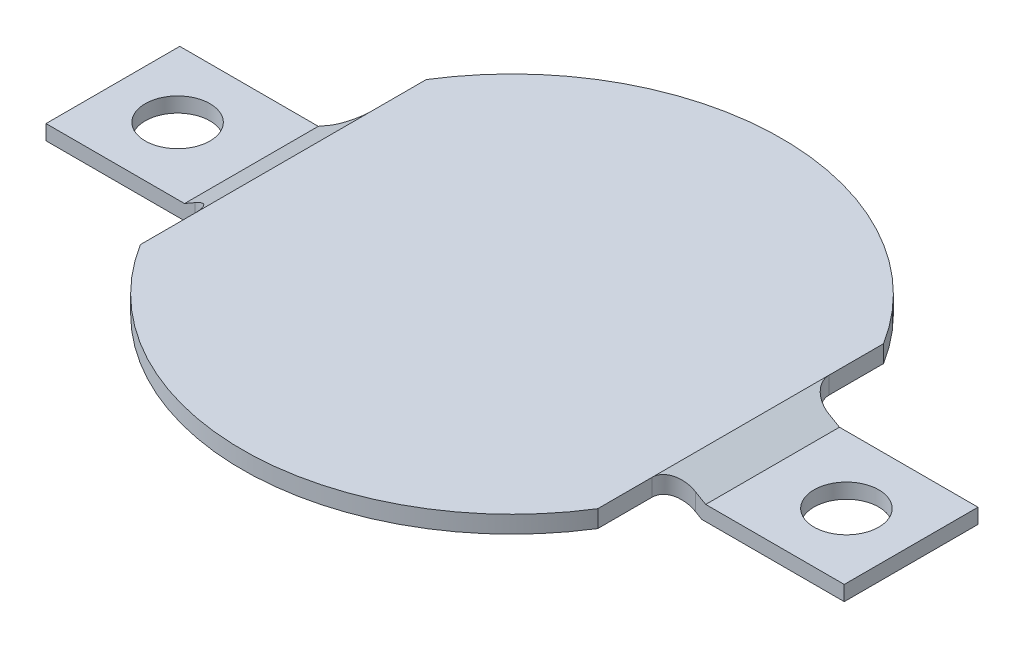
ISO-10303-21;
HEADER;
FILE_DESCRIPTION(('STEP AP214'),'2;1');
FILE_NAME('part.step','',(''),(''),'','','');
FILE_SCHEMA(('AUTOMOTIVE_DESIGN { 1 0 10303 214 1 1 1 1 }'));
ENDSEC;
DATA;
#1=APPLICATION_CONTEXT('core data for automotive mechanical design processes');
#2=APPLICATION_PROTOCOL_DEFINITION('international standard','automotive_design',2000,#1);
#3=PRODUCT_CONTEXT('',#1,'mechanical');
#4=PRODUCT('Part','Part','',(#3));
#5=PRODUCT_RELATED_PRODUCT_CATEGORY('part','',(#4));
#6=PRODUCT_DEFINITION_FORMATION('','',#4);
#7=PRODUCT_DEFINITION_CONTEXT('part definition',#1,'design');
#8=PRODUCT_DEFINITION('design','',#6,#7);
#9=PRODUCT_DEFINITION_SHAPE('','',#8);
#10=(LENGTH_UNIT() NAMED_UNIT(*) SI_UNIT(.MILLI.,.METRE.));
#11=(NAMED_UNIT(*) PLANE_ANGLE_UNIT() SI_UNIT($,.RADIAN.));
#12=(NAMED_UNIT(*) SI_UNIT($,.STERADIAN.) SOLID_ANGLE_UNIT());
#13=UNCERTAINTY_MEASURE_WITH_UNIT(LENGTH_MEASURE(1.E-05),#10,'distance_accuracy_value','');
#14=(GEOMETRIC_REPRESENTATION_CONTEXT(3) GLOBAL_UNCERTAINTY_ASSIGNED_CONTEXT((#13)) GLOBAL_UNIT_ASSIGNED_CONTEXT((#10,
#11,#12)) REPRESENTATION_CONTEXT('',''));
#15=CARTESIAN_POINT('',(0.,0.,0.));
#16=DIRECTION('',(0.,0.,1.));
#17=DIRECTION('',(1.,0.,0.));
#18=AXIS2_PLACEMENT_3D('',#15,#16,#17);
#19=CARTESIAN_POINT('',(3.020776362049,-0.189588181024,-0.7874));
#20=DIRECTION('',(0.,-1.,0.));
#21=DIRECTION('',(0.,0.,-1.));
#22=AXIS2_PLACEMENT_3D('',#19,#20,#21);
#23=PLANE('',#22);
#24=CARTESIAN_POINT('',(3.937,-0.189588181023999,0.));
#25=DIRECTION('',(0.,1.,0.));
#26=DIRECTION('',(-1.,0.,0.));
#27=AXIS2_PLACEMENT_3D('',#24,#25,#26);
#28=CIRCLE('',#27,0.381);
#29=CARTESIAN_POINT('',(3.556,-0.189588181023998,0.));
#30=VERTEX_POINT('',#29);
#31=EDGE_CURVE('E240',#30,#30,#28,.T.);
#32=ORIENTED_EDGE('',*,*,#31,.T.);
#33=EDGE_LOOP('',(#32));
#34=FACE_BOUND('',#33,.T.);
#35=DIRECTION('',(1.,0.,0.));
#36=VECTOR('',#35,1.);
#37=CARTESIAN_POINT('',(4.419475976756,-0.189588181024039,-0.787400000000001));
#38=LINE('',#37,#36);
#39=CARTESIAN_POINT('',(3.02077636204896,-0.189588181024049,-0.7874));
#40=VERTEX_POINT('',#39);
#41=CARTESIAN_POINT('',(4.699,-0.18958818102402,-0.787400000000001));
#42=VERTEX_POINT('',#41);
#43=EDGE_CURVE('E279',#40,#42,#38,.T.);
#44=ORIENTED_EDGE('',*,*,#43,.T.);
#45=DIRECTION('',(0.,0.,-1.));
#46=VECTOR('',#45,1.);
#47=CARTESIAN_POINT('',(4.699,-0.189588181024,0.));
#48=LINE('',#47,#46);
#49=CARTESIAN_POINT('',(4.699,-0.189588181024,0.787400000000001));
#50=VERTEX_POINT('',#49);
#51=EDGE_CURVE('E243',#50,#42,#48,.T.);
#52=ORIENTED_EDGE('',*,*,#51,.F.);
#53=DIRECTION('',(1.,0.,0.));
#54=VECTOR('',#53,1.);
#55=CARTESIAN_POINT('',(4.419475976756,-0.189588181024,0.787400000000001));
#56=LINE('',#55,#54);
#57=CARTESIAN_POINT('',(3.02077636204896,-0.189588181024036,0.787400000000001));
#58=VERTEX_POINT('',#57);
#59=EDGE_CURVE('E325',#50,#58,#56,.F.);
#60=ORIENTED_EDGE('',*,*,#59,.T.);
#61=DIRECTION('',(0.,0.,1.));
#62=VECTOR('',#61,1.);
#63=CARTESIAN_POINT('',(3.02077636204896,-0.189588181024054,-0.7874));
#64=LINE('',#63,#62);
#65=EDGE_CURVE('E242',#58,#40,#64,.F.);
#66=ORIENTED_EDGE('',*,*,#65,.T.);
#67=EDGE_LOOP('',(#44,#52,#60,#66));
#68=FACE_BOUND('',#67,.T.);
#69=ADVANCED_FACE('F16',(#34,#68),#23,.T.);
#70=CARTESIAN_POINT('',(-3.020776362049,-0.189588181024,-0.7874));
#71=DIRECTION('',(0.,1.,0.));
#72=DIRECTION('',(0.,0.,1.));
#73=AXIS2_PLACEMENT_3D('',#70,#71,#72);
#74=PLANE('',#73);
#75=DIRECTION('',(0.,0.,1.));
#76=VECTOR('',#75,1.);
#77=CARTESIAN_POINT('',(-3.02077636204897,-0.189588181024059,-0.7874));
#78=LINE('',#77,#76);
#79=CARTESIAN_POINT('',(-3.02077636204896,-0.189588181024039,0.787400000000001));
#80=VERTEX_POINT('',#79);
#81=CARTESIAN_POINT('',(-3.02077636204897,-0.189588181024046,-0.7874));
#82=VERTEX_POINT('',#81);
#83=EDGE_CURVE('E150',#80,#82,#78,.F.);
#84=ORIENTED_EDGE('',*,*,#83,.F.);
#85=DIRECTION('',(1.,0.,0.));
#86=VECTOR('',#85,1.);
#87=CARTESIAN_POINT('',(-4.419475976756,-0.189588181024,0.787400000000001));
#88=LINE('',#87,#86);
#89=CARTESIAN_POINT('',(-4.699,-0.189588181024,0.787400000000001));
#90=VERTEX_POINT('',#89);
#91=EDGE_CURVE('E146',#90,#80,#88,.T.);
#92=ORIENTED_EDGE('',*,*,#91,.F.);
#93=DIRECTION('',(0.,0.,1.));
#94=VECTOR('',#93,1.);
#95=CARTESIAN_POINT('',(-4.699,-0.189588181024,0.));
#96=LINE('',#95,#94);
#97=CARTESIAN_POINT('',(-4.699,-0.18958818102401,-0.787400000000001));
#98=VERTEX_POINT('',#97);
#99=EDGE_CURVE('E137',#98,#90,#96,.T.);
#100=ORIENTED_EDGE('',*,*,#99,.F.);
#101=DIRECTION('',(1.,0.,0.));
#102=VECTOR('',#101,1.);
#103=CARTESIAN_POINT('',(-4.419475976756,-0.18958818102402,-0.787400000000001));
#104=LINE('',#103,#102);
#105=EDGE_CURVE('E125',#82,#98,#104,.F.);
#106=ORIENTED_EDGE('',*,*,#105,.F.);
#107=EDGE_LOOP('',(#84,#92,#100,#106));
#108=FACE_BOUND('',#107,.T.);
#109=CARTESIAN_POINT('',(-3.937,-0.189588181024001,0.));
#110=DIRECTION('',(0.,1.,0.));
#111=DIRECTION('',(-1.,0.,0.));
#112=AXIS2_PLACEMENT_3D('',#109,#110,#111);
#113=CIRCLE('',#112,0.381);
#114=CARTESIAN_POINT('',(-4.318,-0.189588181024002,0.));
#115=VERTEX_POINT('',#114);
#116=EDGE_CURVE('E19',#115,#115,#113,.T.);
#117=ORIENTED_EDGE('',*,*,#116,.T.);
#118=EDGE_LOOP('',(#117));
#119=FACE_BOUND('',#118,.T.);
#120=ADVANCED_FACE('F147',(#108,#119),#74,.F.);
#121=CARTESIAN_POINT('',(-3.937,-0.216811818976,0.));
#122=DIRECTION('',(0.,1.,0.));
#123=DIRECTION('',(-1.,0.,0.));
#124=AXIS2_PLACEMENT_3D('',#121,#122,#123);
#125=CYLINDRICAL_SURFACE('',#124,0.381);
#126=ORIENTED_EDGE('',*,*,#116,.F.);
#127=EDGE_LOOP('',(#126));
#128=FACE_BOUND('',#127,.T.);
#129=CARTESIAN_POINT('',(-3.937,-0.0136118189755092,0.));
#130=DIRECTION('',(0.,1.,0.));
#131=DIRECTION('',(-1.,0.,0.));
#132=AXIS2_PLACEMENT_3D('',#129,#130,#131);
#133=CIRCLE('',#132,0.381);
#134=CARTESIAN_POINT('',(-4.318,-0.01361181897551,0.));
#135=VERTEX_POINT('',#134);
#136=EDGE_CURVE('E174',#135,#135,#133,.T.);
#137=ORIENTED_EDGE('',*,*,#136,.T.);
#138=EDGE_LOOP('',(#137));
#139=FACE_BOUND('',#138,.T.);
#140=ADVANCED_FACE('F473',(#128,#139),#125,.F.);
#141=CARTESIAN_POINT('',(-4.699,-0.1016,0.));
#142=DIRECTION('',(-1.,0.,0.));
#143=DIRECTION('',(0.,0.,1.));
#144=AXIS2_PLACEMENT_3D('',#141,#142,#143);
#145=PLANE('',#144);
#146=DIRECTION('',(0.,1.,0.));
#147=VECTOR('',#146,1.);
#148=CARTESIAN_POINT('',(-4.699,-0.793927780091,-0.7874));
#149=LINE('',#148,#147);
#150=CARTESIAN_POINT('',(-4.699,-0.0136118189755,-0.787400000000001));
#151=VERTEX_POINT('',#150);
#152=EDGE_CURVE('E144',#98,#151,#149,.T.);
#153=ORIENTED_EDGE('',*,*,#152,.F.);
#154=ORIENTED_EDGE('',*,*,#99,.T.);
#155=DIRECTION('',(0.,-1.,0.));
#156=VECTOR('',#155,1.);
#157=CARTESIAN_POINT('',(-4.699,-0.793927780091,0.7874));
#158=LINE('',#157,#156);
#159=CARTESIAN_POINT('',(-4.699,-0.0136118189755,0.7874));
#160=VERTEX_POINT('',#159);
#161=EDGE_CURVE('E141',#160,#90,#158,.T.);
#162=ORIENTED_EDGE('',*,*,#161,.F.);
#163=DIRECTION('',(0.,0.,-1.));
#164=VECTOR('',#163,1.);
#165=CARTESIAN_POINT('',(-4.699,-0.0136118189755,0.7874));
#166=LINE('',#165,#164);
#167=EDGE_CURVE('E171',#160,#151,#166,.T.);
#168=ORIENTED_EDGE('',*,*,#167,.T.);
#169=EDGE_LOOP('',(#153,#154,#162,#168));
#170=FACE_BOUND('',#169,.T.);
#171=ADVANCED_FACE('F139',(#170),#145,.T.);
#172=CARTESIAN_POINT('',(-4.419475976756,-0.793927780091,-0.7874));
#173=DIRECTION('',(0.,0.,-1.));
#174=DIRECTION('',(0.,1.,0.));
#175=AXIS2_PLACEMENT_3D('',#172,#173,#174);
#176=PLANE('',#175);
#177=DIRECTION('',(0.866025403784329,0.50000000000019,0.));
#178=VECTOR('',#177,1.);
#179=CARTESIAN_POINT('',(-4.419475976756,-0.997127780091,-0.7874));
#180=LINE('',#179,#178);
#181=CARTESIAN_POINT('',(-2.9464,-0.146646968373722,-0.7874));
#182=VERTEX_POINT('',#181);
#183=EDGE_CURVE('E239',#82,#182,#180,.T.);
#184=ORIENTED_EDGE('',*,*,#183,.F.);
#185=ORIENTED_EDGE('',*,*,#105,.T.);
#186=ORIENTED_EDGE('',*,*,#152,.T.);
#187=DIRECTION('',(1.,0.,0.));
#188=VECTOR('',#187,1.);
#189=CARTESIAN_POINT('',(-3.067929086147,-0.0136118189755,-0.787400000000001));
#190=LINE('',#189,#188);
#191=CARTESIAN_POINT('',(-3.0679290861472,-0.0136118189753157,-0.787400000000001));
#192=VERTEX_POINT('',#191);
#193=EDGE_CURVE('E173',#151,#192,#190,.T.);
#194=ORIENTED_EDGE('',*,*,#193,.T.);
#195=DIRECTION('',(0.866025403784383,0.500000000000096,0.));
#196=VECTOR('',#195,1.);
#197=CARTESIAN_POINT('',(-3.06792908614709,-0.013611818975349,-0.7874));
#198=LINE('',#197,#196);
#199=CARTESIAN_POINT('',(-2.9464,0.0565530316261686,-0.7874));
#200=VERTEX_POINT('',#199);
#201=EDGE_CURVE('E178',#192,#200,#198,.T.);
#202=ORIENTED_EDGE('',*,*,#201,.T.);
#203=DIRECTION('',(0.,1.,0.));
#204=VECTOR('',#203,1.);
#205=CARTESIAN_POINT('',(-2.9464,-0.793927780091,-0.7874));
#206=LINE('',#205,#204);
#207=EDGE_CURVE('E114',#200,#182,#206,.F.);
#208=ORIENTED_EDGE('',*,*,#207,.T.);
#209=EDGE_LOOP('',(#184,#185,#186,#194,#202,#208));
#210=FACE_BOUND('',#209,.T.);
#211=ADVANCED_FACE('F306',(#210),#176,.T.);
#212=CARTESIAN_POINT('',(-4.419475976756,-0.793927780091,0.7874));
#213=DIRECTION('',(0.,0.,1.));
#214=DIRECTION('',(0.,-1.,0.));
#215=AXIS2_PLACEMENT_3D('',#212,#213,#214);
#216=PLANE('',#215);
#217=DIRECTION('',(-0.866025403783761,-0.500000000001173,0.));
#218=VECTOR('',#217,1.);
#219=CARTESIAN_POINT('',(-2.9464,0.0565530316260591,0.7874));
#220=LINE('',#219,#218);
#221=CARTESIAN_POINT('',(-2.9464,0.0565530316261687,0.7874));
#222=VERTEX_POINT('',#221);
#223=CARTESIAN_POINT('',(-3.06792908614702,-0.0136118189755095,0.7874));
#224=VERTEX_POINT('',#223);
#225=EDGE_CURVE('E290',#222,#224,#220,.T.);
#226=ORIENTED_EDGE('',*,*,#225,.T.);
#227=DIRECTION('',(1.,0.,0.));
#228=VECTOR('',#227,1.);
#229=CARTESIAN_POINT('',(-3.067929086147,-0.0136118189755,0.7874));
#230=LINE('',#229,#228);
#231=EDGE_CURVE('E159',#224,#160,#230,.F.);
#232=ORIENTED_EDGE('',*,*,#231,.T.);
#233=ORIENTED_EDGE('',*,*,#161,.T.);
#234=ORIENTED_EDGE('',*,*,#91,.T.);
#235=DIRECTION('',(0.866025403784329,0.50000000000019,0.));
#236=VECTOR('',#235,1.);
#237=CARTESIAN_POINT('',(-4.419475976756,-0.997127780091,0.787400000000001));
#238=LINE('',#237,#236);
#239=CARTESIAN_POINT('',(-2.9464,-0.146646968373722,0.7874));
#240=VERTEX_POINT('',#239);
#241=EDGE_CURVE('E311',#240,#80,#238,.F.);
#242=ORIENTED_EDGE('',*,*,#241,.F.);
#243=DIRECTION('',(0.,-1.,0.));
#244=VECTOR('',#243,1.);
#245=CARTESIAN_POINT('',(-2.9464,-0.793927780091,0.7874));
#246=LINE('',#245,#244);
#247=EDGE_CURVE('E154',#240,#222,#246,.F.);
#248=ORIENTED_EDGE('',*,*,#247,.T.);
#249=EDGE_LOOP('',(#226,#232,#233,#234,#242,#248));
#250=FACE_BOUND('',#249,.T.);
#251=ADVANCED_FACE('F157',(#250),#216,.T.);
#252=CARTESIAN_POINT('',(4.419475976756,-0.793927780091,-0.7874));
#253=DIRECTION('',(0.,0.,1.));
#254=DIRECTION('',(0.,-1.,0.));
#255=AXIS2_PLACEMENT_3D('',#252,#253,#254);
#256=PLANE('',#255);
#257=DIRECTION('',(-0.866025403783762,0.500000000001172,0.));
#258=VECTOR('',#257,1.);
#259=CARTESIAN_POINT('',(3.067929086147,-0.0136118189754997,-0.7874));
#260=LINE('',#259,#258);
#261=CARTESIAN_POINT('',(3.06792908614709,-0.0136118189753484,-0.787400000000001));
#262=VERTEX_POINT('',#261);
#263=CARTESIAN_POINT('',(2.9464,0.0565530316261687,-0.7874));
#264=VERTEX_POINT('',#263);
#265=EDGE_CURVE('E276',#262,#264,#260,.T.);
#266=ORIENTED_EDGE('',*,*,#265,.F.);
#267=DIRECTION('',(1.,0.,0.));
#268=VECTOR('',#267,1.);
#269=CARTESIAN_POINT('',(3.067929086147,-0.0136118189755,-0.7874));
#270=LINE('',#269,#268);
#271=CARTESIAN_POINT('',(4.699,-0.0136118189755,-0.787400000000001));
#272=VERTEX_POINT('',#271);
#273=EDGE_CURVE('E234',#272,#262,#270,.F.);
#274=ORIENTED_EDGE('',*,*,#273,.F.);
#275=DIRECTION('',(0.,1.,0.));
#276=VECTOR('',#275,1.);
#277=CARTESIAN_POINT('',(4.699,-0.1016,-0.787400000000001));
#278=LINE('',#277,#276);
#279=EDGE_CURVE('E256',#42,#272,#278,.T.);
#280=ORIENTED_EDGE('',*,*,#279,.F.);
#281=ORIENTED_EDGE('',*,*,#43,.F.);
#282=DIRECTION('',(-0.866025403784329,0.50000000000019,0.));
#283=VECTOR('',#282,1.);
#284=CARTESIAN_POINT('',(4.419475976756,-0.997127780091,-0.7874));
#285=LINE('',#284,#283);
#286=CARTESIAN_POINT('',(2.9464,-0.146646968373722,-0.7874));
#287=VERTEX_POINT('',#286);
#288=EDGE_CURVE('E247',#40,#287,#285,.T.);
#289=ORIENTED_EDGE('',*,*,#288,.T.);
#290=DIRECTION('',(0.,-1.,0.));
#291=VECTOR('',#290,1.);
#292=CARTESIAN_POINT('',(2.9464,-0.793927780091,-0.7874));
#293=LINE('',#292,#291);
#294=EDGE_CURVE('E278',#264,#287,#293,.T.);
#295=ORIENTED_EDGE('',*,*,#294,.F.);
#296=EDGE_LOOP('',(#266,#274,#280,#281,#289,#295));
#297=FACE_BOUND('',#296,.T.);
#298=ADVANCED_FACE('F361',(#297),#256,.F.);
#299=CARTESIAN_POINT('',(4.419475976756,-0.793927780091,0.7874));
#300=DIRECTION('',(0.,0.,-1.));
#301=DIRECTION('',(0.,1.,0.));
#302=AXIS2_PLACEMENT_3D('',#299,#300,#301);
#303=PLANE('',#302);
#304=DIRECTION('',(-0.866025403784329,0.50000000000019,0.));
#305=VECTOR('',#304,1.);
#306=CARTESIAN_POINT('',(4.419475976756,-0.997127780091,0.787400000000001));
#307=LINE('',#306,#305);
#308=CARTESIAN_POINT('',(2.9464,-0.146646968373722,0.7874));
#309=VERTEX_POINT('',#308);
#310=EDGE_CURVE('E313',#309,#58,#307,.F.);
#311=ORIENTED_EDGE('',*,*,#310,.T.);
#312=ORIENTED_EDGE('',*,*,#59,.F.);
#313=DIRECTION('',(0.,1.,0.));
#314=VECTOR('',#313,1.);
#315=CARTESIAN_POINT('',(4.699,-0.1016,0.7874));
#316=LINE('',#315,#314);
#317=CARTESIAN_POINT('',(4.699,-0.0136118189754496,0.7874));
#318=VERTEX_POINT('',#317);
#319=EDGE_CURVE('E250',#318,#50,#316,.F.);
#320=ORIENTED_EDGE('',*,*,#319,.F.);
#321=DIRECTION('',(1.,0.,0.));
#322=VECTOR('',#321,1.);
#323=CARTESIAN_POINT('',(3.067929086147,-0.0136118189755,0.7874));
#324=LINE('',#323,#322);
#325=CARTESIAN_POINT('',(3.06792908614707,-0.0136118189753958,0.7874));
#326=VERTEX_POINT('',#325);
#327=EDGE_CURVE('E266',#326,#318,#324,.T.);
#328=ORIENTED_EDGE('',*,*,#327,.F.);
#329=DIRECTION('',(0.866025403784202,-0.50000000000041,0.));
#330=VECTOR('',#329,1.);
#331=CARTESIAN_POINT('',(2.9464,0.0565530316260591,0.7874));
#332=LINE('',#331,#330);
#333=CARTESIAN_POINT('',(2.9464,0.0565530316261687,0.7874));
#334=VERTEX_POINT('',#333);
#335=EDGE_CURVE('E328',#334,#326,#332,.T.);
#336=ORIENTED_EDGE('',*,*,#335,.F.);
#337=DIRECTION('',(0.,1.,0.));
#338=VECTOR('',#337,1.);
#339=CARTESIAN_POINT('',(2.9464,-0.793927780091,0.7874));
#340=LINE('',#339,#338);
#341=EDGE_CURVE('E287',#309,#334,#340,.T.);
#342=ORIENTED_EDGE('',*,*,#341,.F.);
#343=EDGE_LOOP('',(#311,#312,#320,#328,#336,#342));
#344=FACE_BOUND('',#343,.T.);
#345=ADVANCED_FACE('F350',(#344),#303,.F.);
#346=CARTESIAN_POINT('',(4.699,-0.1016,0.));
#347=DIRECTION('',(1.,0.,0.));
#348=DIRECTION('',(0.,0.,-1.));
#349=AXIS2_PLACEMENT_3D('',#346,#347,#348);
#350=PLANE('',#349);
#351=ORIENTED_EDGE('',*,*,#319,.T.);
#352=ORIENTED_EDGE('',*,*,#51,.T.);
#353=ORIENTED_EDGE('',*,*,#279,.T.);
#354=DIRECTION('',(0.,0.,1.));
#355=VECTOR('',#354,1.);
#356=CARTESIAN_POINT('',(4.699,-0.0136118189755,0.7874));
#357=LINE('',#356,#355);
#358=EDGE_CURVE('E230',#318,#272,#357,.F.);
#359=ORIENTED_EDGE('',*,*,#358,.F.);
#360=EDGE_LOOP('',(#351,#352,#353,#359));
#361=FACE_BOUND('',#360,.T.);
#362=ADVANCED_FACE('F365',(#361),#350,.T.);
#363=CARTESIAN_POINT('',(3.937,-0.216811818976,0.));
#364=DIRECTION('',(0.,1.,0.));
#365=DIRECTION('',(-1.,0.,0.));
#366=AXIS2_PLACEMENT_3D('',#363,#364,#365);
#367=CYLINDRICAL_SURFACE('',#366,0.381);
#368=ORIENTED_EDGE('',*,*,#31,.F.);
#369=EDGE_LOOP('',(#368));
#370=FACE_BOUND('',#369,.T.);
#371=CARTESIAN_POINT('',(3.937,-0.0136118189755108,0.));
#372=DIRECTION('',(0.,1.,0.));
#373=DIRECTION('',(-1.,0.,0.));
#374=AXIS2_PLACEMENT_3D('',#371,#372,#373);
#375=CIRCLE('',#374,0.381);
#376=CARTESIAN_POINT('',(3.556,-0.01361181897551,0.));
#377=VERTEX_POINT('',#376);
#378=EDGE_CURVE('E227',#377,#377,#375,.F.);
#379=ORIENTED_EDGE('',*,*,#378,.F.);
#380=EDGE_LOOP('',(#379));
#381=FACE_BOUND('',#380,.T.);
#382=ADVANCED_FACE('F518',(#370,#381),#367,.F.);
#383=CARTESIAN_POINT('',(4.419475976756,-0.997127780091,-0.7874));
#384=DIRECTION('',(0.50000000000019,0.866025403784329,0.));
#385=DIRECTION('',(-0.866025403784329,0.50000000000019,0.));
#386=AXIS2_PLACEMENT_3D('',#383,#384,#385);
#387=PLANE('',#386);
#388=CARTESIAN_POINT('',(2.9464,-0.146646968373722,1.0414));
#389=DIRECTION('',(0.50000000000019,0.866025403784329,0.));
#390=DIRECTION('',(-0.866025403784329,0.50000000000019,0.));
#391=AXIS2_PLACEMENT_3D('',#388,#389,#390);
#392=ELLIPSE('',#391,0.293293936748367,0.254);
#393=CARTESIAN_POINT('',(2.6924,2.58771953517978E-13,1.0414));
#394=VERTEX_POINT('',#393);
#395=EDGE_CURVE('E225',#309,#394,#392,.T.);
#396=ORIENTED_EDGE('',*,*,#395,.T.);
#397=DIRECTION('',(0.,0.,1.));
#398=VECTOR('',#397,1.);
#399=CARTESIAN_POINT('',(2.6924,0.,0.));
#400=LINE('',#399,#398);
#401=CARTESIAN_POINT('',(2.6924,2.58771953517978E-13,-1.0414));
#402=VERTEX_POINT('',#401);
#403=EDGE_CURVE('E224',#394,#402,#400,.F.);
#404=ORIENTED_EDGE('',*,*,#403,.T.);
#405=CARTESIAN_POINT('',(2.9464,-0.146646968373722,-1.0414));
#406=DIRECTION('',(0.50000000000019,0.866025403784329,0.));
#407=DIRECTION('',(0.866025403784329,-0.50000000000019,0.));
#408=AXIS2_PLACEMENT_3D('',#405,#406,#407);
#409=ELLIPSE('',#408,0.293293936748367,0.254);
#410=EDGE_CURVE('E221',#402,#287,#409,.T.);
#411=ORIENTED_EDGE('',*,*,#410,.T.);
#412=ORIENTED_EDGE('',*,*,#288,.F.);
#413=ORIENTED_EDGE('',*,*,#65,.F.);
#414=ORIENTED_EDGE('',*,*,#310,.F.);
#415=EDGE_LOOP('',(#396,#404,#411,#412,#413,#414));
#416=FACE_BOUND('',#415,.T.);
#417=ADVANCED_FACE('F394',(#416),#387,.F.);
#418=CARTESIAN_POINT('',(-4.419475976756,-0.997127780091,-0.7874));
#419=DIRECTION('',(0.50000000000019,-0.866025403784329,0.));
#420=DIRECTION('',(0.866025403784329,0.50000000000019,0.));
#421=AXIS2_PLACEMENT_3D('',#418,#419,#420);
#422=PLANE('',#421);
#423=ORIENTED_EDGE('',*,*,#183,.T.);
#424=CARTESIAN_POINT('',(-2.9464,-0.146646968373722,-1.0414));
#425=DIRECTION('',(0.50000000000019,-0.866025403784329,0.));
#426=DIRECTION('',(0.866025403784329,0.50000000000019,0.));
#427=AXIS2_PLACEMENT_3D('',#424,#425,#426);
#428=ELLIPSE('',#427,0.293293936748367,0.254);
#429=CARTESIAN_POINT('',(-2.6924,2.58785506045134E-13,-1.0414));
#430=VERTEX_POINT('',#429);
#431=EDGE_CURVE('E237',#182,#430,#428,.F.);
#432=ORIENTED_EDGE('',*,*,#431,.T.);
#433=DIRECTION('',(0.,0.,1.));
#434=VECTOR('',#433,1.);
#435=CARTESIAN_POINT('',(-2.6924,0.,0.));
#436=LINE('',#435,#434);
#437=CARTESIAN_POINT('',(-2.6924,2.58785506045134E-13,1.0414));
#438=VERTEX_POINT('',#437);
#439=EDGE_CURVE('E220',#430,#438,#436,.T.);
#440=ORIENTED_EDGE('',*,*,#439,.T.);
#441=CARTESIAN_POINT('',(-2.9464,-0.146646968373722,1.0414));
#442=DIRECTION('',(0.50000000000019,-0.866025403784329,0.));
#443=DIRECTION('',(-0.866025403784329,-0.50000000000019,0.));
#444=AXIS2_PLACEMENT_3D('',#441,#442,#443);
#445=ELLIPSE('',#444,0.293293936748367,0.254);
#446=EDGE_CURVE('E231',#438,#240,#445,.F.);
#447=ORIENTED_EDGE('',*,*,#446,.T.);
#448=ORIENTED_EDGE('',*,*,#241,.T.);
#449=ORIENTED_EDGE('',*,*,#83,.T.);
#450=EDGE_LOOP('',(#423,#432,#440,#447,#448,#449));
#451=FACE_BOUND('',#450,.T.);
#452=ADVANCED_FACE('F310',(#451),#422,.T.);
#453=CARTESIAN_POINT('',(-3.067929086147,-0.0136118189755,0.7874));
#454=DIRECTION('',(0.,-1.,0.));
#455=DIRECTION('',(0.,0.,-1.));
#456=AXIS2_PLACEMENT_3D('',#453,#454,#455);
#457=PLANE('',#456);
#458=DIRECTION('',(0.,0.,1.));
#459=VECTOR('',#458,1.);
#460=CARTESIAN_POINT('',(-3.06792908614717,-0.0136118189751975,0.7874));
#461=LINE('',#460,#459);
#462=EDGE_CURVE('E216',#192,#224,#461,.T.);
#463=ORIENTED_EDGE('',*,*,#462,.F.);
#464=ORIENTED_EDGE('',*,*,#193,.F.);
#465=ORIENTED_EDGE('',*,*,#167,.F.);
#466=ORIENTED_EDGE('',*,*,#231,.F.);
#467=EDGE_LOOP('',(#463,#464,#465,#466));
#468=FACE_BOUND('',#467,.T.);
#469=ORIENTED_EDGE('',*,*,#136,.F.);
#470=EDGE_LOOP('',(#469));
#471=FACE_BOUND('',#470,.T.);
#472=ADVANCED_FACE('F304',(#468,#471),#457,.F.);
#473=CARTESIAN_POINT('',(-2.9464,0.2032,1.0414));
#474=DIRECTION('',(0.,-1.,0.));
#475=DIRECTION('',(0.,0.,-1.));
#476=AXIS2_PLACEMENT_3D('',#473,#474,#475);
#477=CYLINDRICAL_SURFACE('',#476,0.254);
#478=ORIENTED_EDGE('',*,*,#446,.F.);
#479=DIRECTION('',(0.,1.,0.));
#480=VECTOR('',#479,1.);
#481=CARTESIAN_POINT('',(-2.6924,0.2032,1.0414));
#482=LINE('',#481,#480);
#483=CARTESIAN_POINT('',(-2.6924,0.203200000000259,1.0414));
#484=VERTEX_POINT('',#483);
#485=EDGE_CURVE('E376',#438,#484,#482,.T.);
#486=ORIENTED_EDGE('',*,*,#485,.T.);
#487=CARTESIAN_POINT('',(-2.9464,0.0565530316262783,1.0414));
#488=DIRECTION('',(-0.50000000000019,0.866025403784329,0.));
#489=DIRECTION('',(-0.866025403784329,-0.50000000000019,0.));
#490=AXIS2_PLACEMENT_3D('',#487,#488,#489);
#491=ELLIPSE('',#490,0.293293936748367,0.254);
#492=EDGE_CURVE('E212',#222,#484,#491,.F.);
#493=ORIENTED_EDGE('',*,*,#492,.F.);
#494=ORIENTED_EDGE('',*,*,#247,.F.);
#495=EDGE_LOOP('',(#478,#486,#493,#494));
#496=FACE_BOUND('',#495,.T.);
#497=ADVANCED_FACE('F440',(#496),#477,.F.);
#498=CARTESIAN_POINT('',(3.067929086147,-0.0136118189755,0.7874));
#499=DIRECTION('',(0.,1.,0.));
#500=DIRECTION('',(0.,0.,1.));
#501=AXIS2_PLACEMENT_3D('',#498,#499,#500);
#502=PLANE('',#501);
#503=ORIENTED_EDGE('',*,*,#378,.T.);
#504=EDGE_LOOP('',(#503));
#505=FACE_BOUND('',#504,.T.);
#506=ORIENTED_EDGE('',*,*,#327,.T.);
#507=ORIENTED_EDGE('',*,*,#358,.T.);
#508=ORIENTED_EDGE('',*,*,#273,.T.);
#509=DIRECTION('',(0.,0.,1.));
#510=VECTOR('',#509,1.);
#511=CARTESIAN_POINT('',(3.06792908614717,-0.0136118189751972,0.7874));
#512=LINE('',#511,#510);
#513=EDGE_CURVE('E206',#262,#326,#512,.T.);
#514=ORIENTED_EDGE('',*,*,#513,.T.);
#515=EDGE_LOOP('',(#506,#507,#508,#514));
#516=FACE_BOUND('',#515,.T.);
#517=ADVANCED_FACE('F355',(#505,#516),#502,.T.);
#518=CARTESIAN_POINT('',(2.9464,-0.793927780091,1.0414));
#519=DIRECTION('',(0.,1.,0.));
#520=DIRECTION('',(0.,0.,1.));
#521=AXIS2_PLACEMENT_3D('',#518,#519,#520);
#522=CYLINDRICAL_SURFACE('',#521,0.254);
#523=ORIENTED_EDGE('',*,*,#395,.F.);
#524=ORIENTED_EDGE('',*,*,#341,.T.);
#525=CARTESIAN_POINT('',(2.9464,0.0565530316262783,1.0414));
#526=DIRECTION('',(-0.50000000000019,-0.866025403784329,0.));
#527=DIRECTION('',(-0.866025403784329,0.50000000000019,0.));
#528=AXIS2_PLACEMENT_3D('',#525,#526,#527);
#529=ELLIPSE('',#528,0.293293936748367,0.254);
#530=CARTESIAN_POINT('',(2.6924,0.203200000000259,1.0414));
#531=VERTEX_POINT('',#530);
#532=EDGE_CURVE('E204',#334,#531,#529,.F.);
#533=ORIENTED_EDGE('',*,*,#532,.T.);
#534=DIRECTION('',(0.,1.,0.));
#535=VECTOR('',#534,1.);
#536=CARTESIAN_POINT('',(2.6924,0.2032,1.0414));
#537=LINE('',#536,#535);
#538=EDGE_CURVE('E273',#531,#394,#537,.F.);
#539=ORIENTED_EDGE('',*,*,#538,.T.);
#540=EDGE_LOOP('',(#523,#524,#533,#539));
#541=FACE_BOUND('',#540,.T.);
#542=ADVANCED_FACE('F460',(#541),#522,.F.);
#543=CARTESIAN_POINT('',(2.9464,-0.793927780091,-1.0414));
#544=DIRECTION('',(0.,-1.,0.));
#545=DIRECTION('',(0.,0.,-1.));
#546=AXIS2_PLACEMENT_3D('',#543,#544,#545);
#547=CYLINDRICAL_SURFACE('',#546,0.254);
#548=CARTESIAN_POINT('',(2.9464,0.0565530316262783,-1.0414));
#549=DIRECTION('',(-0.50000000000019,-0.866025403784329,0.));
#550=DIRECTION('',(0.866025403784329,-0.50000000000019,0.));
#551=AXIS2_PLACEMENT_3D('',#548,#549,#550);
#552=ELLIPSE('',#551,0.293293936748367,0.254);
#553=CARTESIAN_POINT('',(2.6924,0.203200000000259,-1.0414));
#554=VERTEX_POINT('',#553);
#555=EDGE_CURVE('E200',#554,#264,#552,.F.);
#556=ORIENTED_EDGE('',*,*,#555,.T.);
#557=ORIENTED_EDGE('',*,*,#294,.T.);
#558=ORIENTED_EDGE('',*,*,#410,.F.);
#559=DIRECTION('',(0.,1.,0.));
#560=VECTOR('',#559,1.);
#561=CARTESIAN_POINT('',(2.6924,0.2032,-1.0414));
#562=LINE('',#561,#560);
#563=EDGE_CURVE('E400',#402,#554,#562,.T.);
#564=ORIENTED_EDGE('',*,*,#563,.T.);
#565=EDGE_LOOP('',(#556,#557,#558,#564));
#566=FACE_BOUND('',#565,.T.);
#567=ADVANCED_FACE('F399',(#566),#547,.F.);
#568=CARTESIAN_POINT('',(0.,0.,0.));
#569=DIRECTION('',(0.,1.,0.));
#570=DIRECTION('',(0.,0.,1.));
#571=AXIS2_PLACEMENT_3D('',#568,#569,#570);
#572=PLANE('',#571);
#573=ORIENTED_EDGE('',*,*,#439,.F.);
#574=DIRECTION('',(0.,0.,1.));
#575=VECTOR('',#574,1.);
#576=CARTESIAN_POINT('',(-2.6924,0.,0.));
#577=LINE('',#576,#575);
#578=CARTESIAN_POINT('',(-2.6924,0.,-1.6827380188252));
#579=VERTEX_POINT('',#578);
#580=EDGE_CURVE('E377',#579,#430,#577,.T.);
#581=ORIENTED_EDGE('',*,*,#580,.F.);
#582=CARTESIAN_POINT('',(0.,0.,0.));
#583=DIRECTION('',(0.,-1.,0.));
#584=DIRECTION('',(0.,0.,-1.));
#585=AXIS2_PLACEMENT_3D('',#582,#583,#584);
#586=CIRCLE('',#585,3.175);
#587=CARTESIAN_POINT('',(2.69240000000003,0.,-1.68273801882522));
#588=VERTEX_POINT('',#587);
#589=EDGE_CURVE('E195',#588,#579,#586,.F.);
#590=ORIENTED_EDGE('',*,*,#589,.F.);
#591=DIRECTION('',(0.,0.,1.));
#592=VECTOR('',#591,1.);
#593=CARTESIAN_POINT('',(2.6924,0.,1.682738018825));
#594=LINE('',#593,#592);
#595=EDGE_CURVE('E203',#588,#402,#594,.T.);
#596=ORIENTED_EDGE('',*,*,#595,.T.);
#597=ORIENTED_EDGE('',*,*,#403,.F.);
#598=DIRECTION('',(0.,0.,1.));
#599=VECTOR('',#598,1.);
#600=CARTESIAN_POINT('',(2.6924,2.58609323192105E-13,1.682738018825));
#601=LINE('',#600,#599);
#602=CARTESIAN_POINT('',(2.6924,1.29304661596052E-13,1.6827380188252));
#603=VERTEX_POINT('',#602);
#604=EDGE_CURVE('E210',#394,#603,#601,.T.);
#605=ORIENTED_EDGE('',*,*,#604,.T.);
#606=CARTESIAN_POINT('',(0.,0.,0.));
#607=DIRECTION('',(0.,-1.,0.));
#608=DIRECTION('',(0.,0.,-1.));
#609=AXIS2_PLACEMENT_3D('',#606,#607,#608);
#610=CIRCLE('',#609,3.175);
#611=CARTESIAN_POINT('',(-2.69240000000003,0.,1.68273801882522));
#612=VERTEX_POINT('',#611);
#613=EDGE_CURVE('E207',#612,#603,#610,.F.);
#614=ORIENTED_EDGE('',*,*,#613,.F.);
#615=DIRECTION('',(0.,0.,-1.));
#616=VECTOR('',#615,1.);
#617=CARTESIAN_POINT('',(-2.6924,0.,1.682738018825));
#618=LINE('',#617,#616);
#619=EDGE_CURVE('E215',#612,#438,#618,.T.);
#620=ORIENTED_EDGE('',*,*,#619,.T.);
#621=EDGE_LOOP('',(#573,#581,#590,#596,#597,#605,#614,#620));
#622=FACE_BOUND('',#621,.T.);
#623=ADVANCED_FACE('F434',(#622),#572,.F.);
#624=CARTESIAN_POINT('',(-2.9464,0.2032,-1.0414));
#625=DIRECTION('',(0.,1.,0.));
#626=DIRECTION('',(0.,0.,1.));
#627=AXIS2_PLACEMENT_3D('',#624,#625,#626);
#628=CYLINDRICAL_SURFACE('',#627,0.254);
#629=CARTESIAN_POINT('',(-2.9464,0.0565530316262783,-1.0414));
#630=DIRECTION('',(-0.50000000000019,0.866025403784329,0.));
#631=DIRECTION('',(0.866025403784329,0.50000000000019,0.));
#632=AXIS2_PLACEMENT_3D('',#629,#630,#631);
#633=ELLIPSE('',#632,0.293293936748367,0.254);
#634=CARTESIAN_POINT('',(-2.6924,0.203200000000259,-1.0414));
#635=VERTEX_POINT('',#634);
#636=EDGE_CURVE('E217',#635,#200,#633,.F.);
#637=ORIENTED_EDGE('',*,*,#636,.F.);
#638=DIRECTION('',(0.,1.,0.));
#639=VECTOR('',#638,1.);
#640=CARTESIAN_POINT('',(-2.6924,0.2032,-1.0414));
#641=LINE('',#640,#639);
#642=EDGE_CURVE('E426',#635,#430,#641,.F.);
#643=ORIENTED_EDGE('',*,*,#642,.T.);
#644=ORIENTED_EDGE('',*,*,#431,.F.);
#645=ORIENTED_EDGE('',*,*,#207,.F.);
#646=EDGE_LOOP('',(#637,#643,#644,#645));
#647=FACE_BOUND('',#646,.T.);
#648=ADVANCED_FACE('F430',(#647),#628,.F.);
#649=CARTESIAN_POINT('',(-4.419475976756,-0.793927780091,0.7874));
#650=DIRECTION('',(-0.50000000000019,0.866025403784329,0.));
#651=DIRECTION('',(-0.866025403784329,-0.50000000000019,0.));
#652=AXIS2_PLACEMENT_3D('',#649,#650,#651);
#653=PLANE('',#652);
#654=ORIENTED_EDGE('',*,*,#225,.F.);
#655=ORIENTED_EDGE('',*,*,#492,.T.);
#656=DIRECTION('',(0.,0.,1.));
#657=VECTOR('',#656,1.);
#658=CARTESIAN_POINT('',(-2.6924,0.2032,0.));
#659=LINE('',#658,#657);
#660=EDGE_CURVE('E432',#635,#484,#659,.T.);
#661=ORIENTED_EDGE('',*,*,#660,.F.);
#662=ORIENTED_EDGE('',*,*,#636,.T.);
#663=ORIENTED_EDGE('',*,*,#201,.F.);
#664=ORIENTED_EDGE('',*,*,#462,.T.);
#665=EDGE_LOOP('',(#654,#655,#661,#662,#663,#664));
#666=FACE_BOUND('',#665,.T.);
#667=ADVANCED_FACE('F299',(#666),#653,.T.);
#668=CARTESIAN_POINT('',(-2.6924,0.2032,1.682738018825));
#669=DIRECTION('',(1.,0.,0.));
#670=DIRECTION('',(0.,0.,-1.));
#671=AXIS2_PLACEMENT_3D('',#668,#669,#670);
#672=PLANE('',#671);
#673=ORIENTED_EDGE('',*,*,#619,.F.);
#674=DIRECTION('',(0.,-1.,0.));
#675=VECTOR('',#674,1.);
#676=CARTESIAN_POINT('',(-2.69240000000006,0.2032,1.68273801882517));
#677=LINE('',#676,#675);
#678=CARTESIAN_POINT('',(-2.69240000000003,0.2032,1.68273801882522));
#679=VERTEX_POINT('',#678);
#680=EDGE_CURVE('E211',#679,#612,#677,.T.);
#681=ORIENTED_EDGE('',*,*,#680,.F.);
#682=DIRECTION('',(0.,0.,1.));
#683=VECTOR('',#682,1.);
#684=CARTESIAN_POINT('',(-2.6924,0.2032,0.));
#685=LINE('',#684,#683);
#686=EDGE_CURVE('E194',#484,#679,#685,.T.);
#687=ORIENTED_EDGE('',*,*,#686,.F.);
#688=ORIENTED_EDGE('',*,*,#485,.F.);
#689=EDGE_LOOP('',(#673,#681,#687,#688));
#690=FACE_BOUND('',#689,.T.);
#691=ADVANCED_FACE('F442',(#690),#672,.F.);
#692=CARTESIAN_POINT('',(0.,0.2032,0.));
#693=DIRECTION('',(0.,-1.,0.));
#694=DIRECTION('',(0.,0.,-1.));
#695=AXIS2_PLACEMENT_3D('',#692,#693,#694);
#696=CYLINDRICAL_SURFACE('',#695,3.175);
#697=ORIENTED_EDGE('',*,*,#613,.T.);
#698=DIRECTION('',(0.,1.,0.));
#699=VECTOR('',#698,1.);
#700=CARTESIAN_POINT('',(2.6924,0.2032,1.68273801882514));
#701=LINE('',#700,#699);
#702=CARTESIAN_POINT('',(2.6924,0.2032,1.6827380188252));
#703=VERTEX_POINT('',#702);
#704=EDGE_CURVE('E373',#603,#703,#701,.T.);
#705=ORIENTED_EDGE('',*,*,#704,.T.);
#706=CARTESIAN_POINT('',(0.,0.2032,0.));
#707=DIRECTION('',(0.,-1.,0.));
#708=DIRECTION('',(0.,0.,-1.));
#709=AXIS2_PLACEMENT_3D('',#706,#707,#708);
#710=CIRCLE('',#709,3.175);
#711=EDGE_CURVE('E190',#679,#703,#710,.F.);
#712=ORIENTED_EDGE('',*,*,#711,.F.);
#713=ORIENTED_EDGE('',*,*,#680,.T.);
#714=EDGE_LOOP('',(#697,#705,#712,#713));
#715=FACE_BOUND('',#714,.T.);
#716=ADVANCED_FACE('F491',(#715),#696,.T.);
#717=CARTESIAN_POINT('',(2.6924,0.2032,1.682738018825));
#718=DIRECTION('',(-1.,0.,0.));
#719=DIRECTION('',(0.,0.,1.));
#720=AXIS2_PLACEMENT_3D('',#717,#718,#719);
#721=PLANE('',#720);
#722=DIRECTION('',(0.,0.,1.));
#723=VECTOR('',#722,1.);
#724=CARTESIAN_POINT('',(2.6924,0.2032,0.));
#725=LINE('',#724,#723);
#726=EDGE_CURVE('E193',#703,#531,#725,.F.);
#727=ORIENTED_EDGE('',*,*,#726,.F.);
#728=ORIENTED_EDGE('',*,*,#704,.F.);
#729=ORIENTED_EDGE('',*,*,#604,.F.);
#730=ORIENTED_EDGE('',*,*,#538,.F.);
#731=EDGE_LOOP('',(#727,#728,#729,#730));
#732=FACE_BOUND('',#731,.T.);
#733=ADVANCED_FACE('F456',(#732),#721,.F.);
#734=CARTESIAN_POINT('',(4.419475976756,-0.793927780091,0.7874));
#735=DIRECTION('',(-0.50000000000019,-0.866025403784329,0.));
#736=DIRECTION('',(0.866025403784329,-0.50000000000019,0.));
#737=AXIS2_PLACEMENT_3D('',#734,#735,#736);
#738=PLANE('',#737);
#739=ORIENTED_EDGE('',*,*,#555,.F.);
#740=DIRECTION('',(0.,0.,1.));
#741=VECTOR('',#740,1.);
#742=CARTESIAN_POINT('',(2.6924,0.2032,0.));
#743=LINE('',#742,#741);
#744=EDGE_CURVE('E411',#531,#554,#743,.F.);
#745=ORIENTED_EDGE('',*,*,#744,.F.);
#746=ORIENTED_EDGE('',*,*,#532,.F.);
#747=ORIENTED_EDGE('',*,*,#335,.T.);
#748=ORIENTED_EDGE('',*,*,#513,.F.);
#749=ORIENTED_EDGE('',*,*,#265,.T.);
#750=EDGE_LOOP('',(#739,#745,#746,#747,#748,#749));
#751=FACE_BOUND('',#750,.T.);
#752=ADVANCED_FACE('F344',(#751),#738,.F.);
#753=CARTESIAN_POINT('',(2.6924,0.2032,1.682738018825));
#754=DIRECTION('',(-1.,0.,0.));
#755=DIRECTION('',(0.,0.,1.));
#756=AXIS2_PLACEMENT_3D('',#753,#754,#755);
#757=PLANE('',#756);
#758=ORIENTED_EDGE('',*,*,#595,.F.);
#759=DIRECTION('',(0.,-1.,0.));
#760=VECTOR('',#759,1.);
#761=CARTESIAN_POINT('',(2.69240000000006,0.2032,-1.68273801882517));
#762=LINE('',#761,#760);
#763=CARTESIAN_POINT('',(2.69240000000003,0.2032,-1.68273801882522));
#764=VERTEX_POINT('',#763);
#765=EDGE_CURVE('E199',#764,#588,#762,.T.);
#766=ORIENTED_EDGE('',*,*,#765,.F.);
#767=DIRECTION('',(0.,0.,1.));
#768=VECTOR('',#767,1.);
#769=CARTESIAN_POINT('',(2.6924,0.2032,0.));
#770=LINE('',#769,#768);
#771=EDGE_CURVE('E189',#554,#764,#770,.F.);
#772=ORIENTED_EDGE('',*,*,#771,.F.);
#773=ORIENTED_EDGE('',*,*,#563,.F.);
#774=EDGE_LOOP('',(#758,#766,#772,#773));
#775=FACE_BOUND('',#774,.T.);
#776=ADVANCED_FACE('F404',(#775),#757,.F.);
#777=CARTESIAN_POINT('',(0.,0.2032,0.));
#778=DIRECTION('',(0.,-1.,0.));
#779=DIRECTION('',(0.,0.,-1.));
#780=AXIS2_PLACEMENT_3D('',#777,#778,#779);
#781=CYLINDRICAL_SURFACE('',#780,3.175);
#782=ORIENTED_EDGE('',*,*,#589,.T.);
#783=DIRECTION('',(0.,1.,0.));
#784=VECTOR('',#783,1.);
#785=CARTESIAN_POINT('',(-2.6924,0.2032,-1.68273801882514));
#786=LINE('',#785,#784);
#787=CARTESIAN_POINT('',(-2.6924,0.2032,-1.6827380188252));
#788=VERTEX_POINT('',#787);
#789=EDGE_CURVE('E198',#579,#788,#786,.T.);
#790=ORIENTED_EDGE('',*,*,#789,.T.);
#791=CARTESIAN_POINT('',(0.,0.2032,0.));
#792=DIRECTION('',(0.,-1.,0.));
#793=DIRECTION('',(0.,0.,-1.));
#794=AXIS2_PLACEMENT_3D('',#791,#792,#793);
#795=CIRCLE('',#794,3.175);
#796=EDGE_CURVE('E25',#764,#788,#795,.F.);
#797=ORIENTED_EDGE('',*,*,#796,.F.);
#798=ORIENTED_EDGE('',*,*,#765,.T.);
#799=EDGE_LOOP('',(#782,#790,#797,#798));
#800=FACE_BOUND('',#799,.T.);
#801=ADVANCED_FACE('F479',(#800),#781,.T.);
#802=CARTESIAN_POINT('',(-2.6924,0.2032,1.682738018825));
#803=DIRECTION('',(1.,0.,0.));
#804=DIRECTION('',(0.,0.,-1.));
#805=AXIS2_PLACEMENT_3D('',#802,#803,#804);
#806=PLANE('',#805);
#807=DIRECTION('',(0.,0.,1.));
#808=VECTOR('',#807,1.);
#809=CARTESIAN_POINT('',(-2.6924,0.2032,0.));
#810=LINE('',#809,#808);
#811=EDGE_CURVE('E11',#788,#635,#810,.T.);
#812=ORIENTED_EDGE('',*,*,#811,.F.);
#813=ORIENTED_EDGE('',*,*,#789,.F.);
#814=ORIENTED_EDGE('',*,*,#580,.T.);
#815=ORIENTED_EDGE('',*,*,#642,.F.);
#816=EDGE_LOOP('',(#812,#813,#814,#815));
#817=FACE_BOUND('',#816,.T.);
#818=ADVANCED_FACE('F425',(#817),#806,.F.);
#819=CARTESIAN_POINT('',(0.,0.2032,0.));
#820=DIRECTION('',(0.,1.,0.));
#821=DIRECTION('',(0.,0.,1.));
#822=AXIS2_PLACEMENT_3D('',#819,#820,#821);
#823=PLANE('',#822);
#824=ORIENTED_EDGE('',*,*,#796,.T.);
#825=ORIENTED_EDGE('',*,*,#811,.T.);
#826=ORIENTED_EDGE('',*,*,#660,.T.);
#827=ORIENTED_EDGE('',*,*,#686,.T.);
#828=ORIENTED_EDGE('',*,*,#711,.T.);
#829=ORIENTED_EDGE('',*,*,#726,.T.);
#830=ORIENTED_EDGE('',*,*,#744,.T.);
#831=ORIENTED_EDGE('',*,*,#771,.T.);
#832=EDGE_LOOP('',(#824,#825,#826,#827,#828,#829,#830,#831));
#833=FACE_BOUND('',#832,.T.);
#834=ADVANCED_FACE('F447',(#833),#823,.T.);
#835=CLOSED_SHELL('',(#69,#120,#140,#171,#211,#251,#298,#345,#362,#382,#417,#452,#472,#497,#517,
#542,#567,#623,#648,#667,#691,#716,#733,#752,#776,#801,#818,#834));
#836=MANIFOLD_SOLID_BREP('B1',#835);
#837=ADVANCED_BREP_SHAPE_REPRESENTATION('',(#18,#836),#14);
#838=SHAPE_DEFINITION_REPRESENTATION(#9,#837);
ENDSEC;
END-ISO-10303-21;
